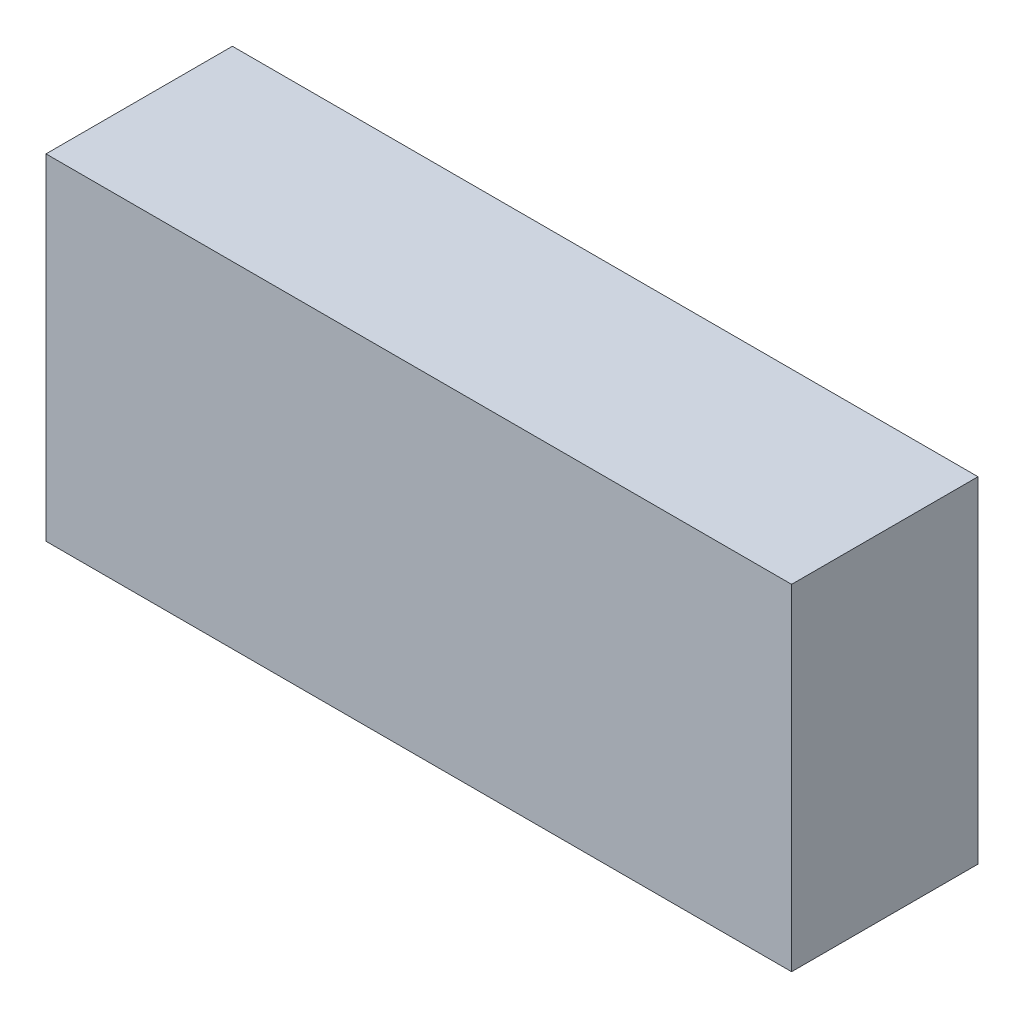
ISO-10303-21;
HEADER;
FILE_DESCRIPTION(('STEP AP214'),'2;1');
FILE_NAME('part.step','',(''),(''),'','','');
FILE_SCHEMA(('AUTOMOTIVE_DESIGN { 1 0 10303 214 1 1 1 1 }'));
ENDSEC;
DATA;
#1=APPLICATION_CONTEXT('core data for automotive mechanical design processes');
#2=APPLICATION_PROTOCOL_DEFINITION('international standard','automotive_design',2000,#1);
#3=PRODUCT_CONTEXT('',#1,'mechanical');
#4=PRODUCT('Part','Part','',(#3));
#5=PRODUCT_RELATED_PRODUCT_CATEGORY('part','',(#4));
#6=PRODUCT_DEFINITION_FORMATION('','',#4);
#7=PRODUCT_DEFINITION_CONTEXT('part definition',#1,'design');
#8=PRODUCT_DEFINITION('design','',#6,#7);
#9=PRODUCT_DEFINITION_SHAPE('','',#8);
#10=(LENGTH_UNIT() NAMED_UNIT(*) SI_UNIT(.MILLI.,.METRE.));
#11=(NAMED_UNIT(*) PLANE_ANGLE_UNIT() SI_UNIT($,.RADIAN.));
#12=(NAMED_UNIT(*) SI_UNIT($,.STERADIAN.) SOLID_ANGLE_UNIT());
#13=UNCERTAINTY_MEASURE_WITH_UNIT(LENGTH_MEASURE(1.E-05),#10,'distance_accuracy_value','');
#14=(GEOMETRIC_REPRESENTATION_CONTEXT(3) GLOBAL_UNCERTAINTY_ASSIGNED_CONTEXT((#13)) GLOBAL_UNIT_ASSIGNED_CONTEXT((#10,
#11,#12)) REPRESENTATION_CONTEXT('',''));
#15=CARTESIAN_POINT('',(0.,0.,0.));
#16=DIRECTION('',(0.,0.,1.));
#17=DIRECTION('',(1.,0.,0.));
#18=AXIS2_PLACEMENT_3D('',#15,#16,#17);
#19=CARTESIAN_POINT('',(-1.,0.45,0.5));
#20=DIRECTION('',(0.,-1.,0.));
#21=DIRECTION('',(0.,0.,-1.));
#22=AXIS2_PLACEMENT_3D('',#19,#20,#21);
#23=PLANE('',#22);
#24=DIRECTION('',(-1.,0.,0.));
#25=VECTOR('',#24,1.);
#26=CARTESIAN_POINT('',(-1.,0.45,0.));
#27=LINE('',#26,#25);
#28=CARTESIAN_POINT('',(1.,0.45,0.));
#29=VERTEX_POINT('',#28);
#30=CARTESIAN_POINT('',(-1.,0.45,0.));
#31=VERTEX_POINT('',#30);
#32=EDGE_CURVE('E97',#29,#31,#27,.T.);
#33=ORIENTED_EDGE('',*,*,#32,.T.);
#34=DIRECTION('',(0.,0.,-1.));
#35=VECTOR('',#34,1.);
#36=CARTESIAN_POINT('',(-1.,0.45,0.5));
#37=LINE('',#36,#35);
#38=CARTESIAN_POINT('',(-1.,0.45,0.5));
#39=VERTEX_POINT('',#38);
#40=EDGE_CURVE('E11',#39,#31,#37,.T.);
#41=ORIENTED_EDGE('',*,*,#40,.F.);
#42=DIRECTION('',(-1.,0.,0.));
#43=VECTOR('',#42,1.);
#44=CARTESIAN_POINT('',(-1.,0.45,0.5));
#45=LINE('',#44,#43);
#46=CARTESIAN_POINT('',(1.,0.45,0.5));
#47=VERTEX_POINT('',#46);
#48=EDGE_CURVE('E85',#47,#39,#45,.T.);
#49=ORIENTED_EDGE('',*,*,#48,.F.);
#50=DIRECTION('',(0.,0.,-1.));
#51=VECTOR('',#50,1.);
#52=CARTESIAN_POINT('',(1.,0.45,0.5));
#53=LINE('',#52,#51);
#54=EDGE_CURVE('E93',#47,#29,#53,.T.);
#55=ORIENTED_EDGE('',*,*,#54,.T.);
#56=EDGE_LOOP('',(#33,#41,#49,#55));
#57=FACE_BOUND('',#56,.T.);
#58=ADVANCED_FACE('F34',(#57),#23,.F.);
#59=CARTESIAN_POINT('',(-1.,-0.45,0.5));
#60=DIRECTION('',(1.,0.,0.));
#61=DIRECTION('',(0.,0.,-1.));
#62=AXIS2_PLACEMENT_3D('',#59,#60,#61);
#63=PLANE('',#62);
#64=DIRECTION('',(0.,-1.,0.));
#65=VECTOR('',#64,1.);
#66=CARTESIAN_POINT('',(-1.,-0.45,0.));
#67=LINE('',#66,#65);
#68=CARTESIAN_POINT('',(-1.,-0.45,0.));
#69=VERTEX_POINT('',#68);
#70=EDGE_CURVE('E89',#31,#69,#67,.T.);
#71=ORIENTED_EDGE('',*,*,#70,.T.);
#72=DIRECTION('',(0.,0.,-1.));
#73=VECTOR('',#72,1.);
#74=CARTESIAN_POINT('',(-1.,-0.45,0.5));
#75=LINE('',#74,#73);
#76=CARTESIAN_POINT('',(-1.,-0.45,0.5));
#77=VERTEX_POINT('',#76);
#78=EDGE_CURVE('E42',#77,#69,#75,.T.);
#79=ORIENTED_EDGE('',*,*,#78,.F.);
#80=DIRECTION('',(0.,-1.,0.));
#81=VECTOR('',#80,1.);
#82=CARTESIAN_POINT('',(-1.,-0.45,0.5));
#83=LINE('',#82,#81);
#84=EDGE_CURVE('E80',#39,#77,#83,.T.);
#85=ORIENTED_EDGE('',*,*,#84,.F.);
#86=ORIENTED_EDGE('',*,*,#40,.T.);
#87=EDGE_LOOP('',(#71,#79,#85,#86));
#88=FACE_BOUND('',#87,.T.);
#89=ADVANCED_FACE('F88',(#88),#63,.F.);
#90=CARTESIAN_POINT('',(1.,-0.45,0.5));
#91=DIRECTION('',(0.,1.,0.));
#92=DIRECTION('',(0.,0.,1.));
#93=AXIS2_PLACEMENT_3D('',#90,#91,#92);
#94=PLANE('',#93);
#95=DIRECTION('',(1.,0.,0.));
#96=VECTOR('',#95,1.);
#97=CARTESIAN_POINT('',(1.,-0.45,0.));
#98=LINE('',#97,#96);
#99=CARTESIAN_POINT('',(1.,-0.45,0.));
#100=VERTEX_POINT('',#99);
#101=EDGE_CURVE('E67',#69,#100,#98,.T.);
#102=ORIENTED_EDGE('',*,*,#101,.T.);
#103=DIRECTION('',(0.,0.,-1.));
#104=VECTOR('',#103,1.);
#105=CARTESIAN_POINT('',(1.,-0.45,0.5));
#106=LINE('',#105,#104);
#107=CARTESIAN_POINT('',(1.,-0.45,0.5));
#108=VERTEX_POINT('',#107);
#109=EDGE_CURVE('E90',#108,#100,#106,.T.);
#110=ORIENTED_EDGE('',*,*,#109,.F.);
#111=DIRECTION('',(1.,0.,0.));
#112=VECTOR('',#111,1.);
#113=CARTESIAN_POINT('',(1.,-0.45,0.5));
#114=LINE('',#113,#112);
#115=EDGE_CURVE('E83',#77,#108,#114,.T.);
#116=ORIENTED_EDGE('',*,*,#115,.F.);
#117=ORIENTED_EDGE('',*,*,#78,.T.);
#118=EDGE_LOOP('',(#102,#110,#116,#117));
#119=FACE_BOUND('',#118,.T.);
#120=ADVANCED_FACE('F91',(#119),#94,.F.);
#121=CARTESIAN_POINT('',(1.,0.45,0.5));
#122=DIRECTION('',(-1.,0.,0.));
#123=DIRECTION('',(0.,0.,1.));
#124=AXIS2_PLACEMENT_3D('',#121,#122,#123);
#125=PLANE('',#124);
#126=DIRECTION('',(0.,1.,0.));
#127=VECTOR('',#126,1.);
#128=CARTESIAN_POINT('',(1.,0.45,0.));
#129=LINE('',#128,#127);
#130=EDGE_CURVE('E73',#100,#29,#129,.T.);
#131=ORIENTED_EDGE('',*,*,#130,.T.);
#132=ORIENTED_EDGE('',*,*,#54,.F.);
#133=DIRECTION('',(0.,1.,0.));
#134=VECTOR('',#133,1.);
#135=CARTESIAN_POINT('',(1.,0.45,0.5));
#136=LINE('',#135,#134);
#137=EDGE_CURVE('E50',#108,#47,#136,.T.);
#138=ORIENTED_EDGE('',*,*,#137,.F.);
#139=ORIENTED_EDGE('',*,*,#109,.T.);
#140=EDGE_LOOP('',(#131,#132,#138,#139));
#141=FACE_BOUND('',#140,.T.);
#142=ADVANCED_FACE('F104',(#141),#125,.F.);
#143=CARTESIAN_POINT('',(0.,0.,0.5));
#144=DIRECTION('',(0.,0.,-1.));
#145=DIRECTION('',(-1.,0.,0.));
#146=AXIS2_PLACEMENT_3D('',#143,#144,#145);
#147=PLANE('',#146);
#148=ORIENTED_EDGE('',*,*,#48,.T.);
#149=ORIENTED_EDGE('',*,*,#84,.T.);
#150=ORIENTED_EDGE('',*,*,#115,.T.);
#151=ORIENTED_EDGE('',*,*,#137,.T.);
#152=EDGE_LOOP('',(#148,#149,#150,#151));
#153=FACE_BOUND('',#152,.T.);
#154=ADVANCED_FACE('F81',(#153),#147,.F.);
#155=CARTESIAN_POINT('',(0.,0.,0.));
#156=DIRECTION('',(0.,0.,-1.));
#157=DIRECTION('',(-1.,0.,0.));
#158=AXIS2_PLACEMENT_3D('',#155,#156,#157);
#159=PLANE('',#158);
#160=ORIENTED_EDGE('',*,*,#32,.F.);
#161=ORIENTED_EDGE('',*,*,#130,.F.);
#162=ORIENTED_EDGE('',*,*,#101,.F.);
#163=ORIENTED_EDGE('',*,*,#70,.F.);
#164=EDGE_LOOP('',(#160,#161,#162,#163));
#165=FACE_BOUND('',#164,.T.);
#166=ADVANCED_FACE('F107',(#165),#159,.T.);
#167=CLOSED_SHELL('',(#58,#89,#120,#142,#154,#166));
#168=MANIFOLD_SOLID_BREP('B2',#167);
#169=ADVANCED_BREP_SHAPE_REPRESENTATION('',(#18,#168),#14);
#170=SHAPE_DEFINITION_REPRESENTATION(#9,#169);
ENDSEC;
END-ISO-10303-21;
